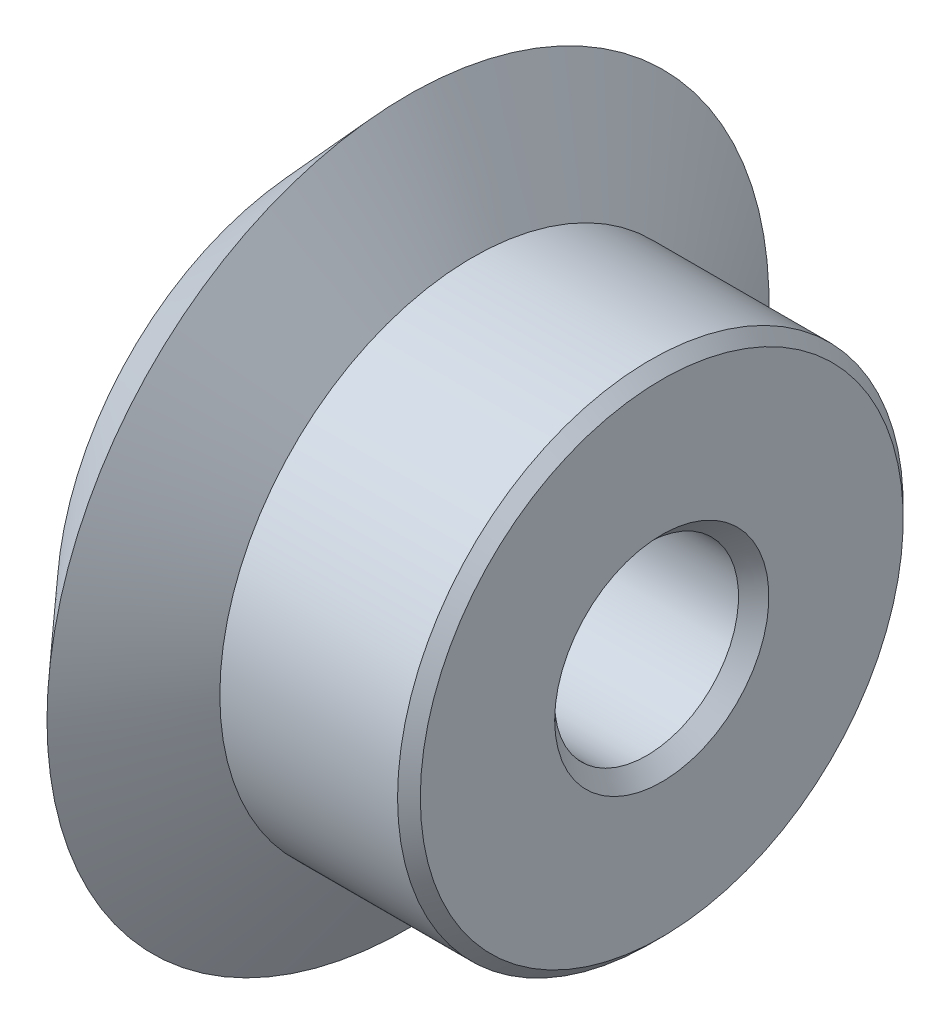
ISO-10303-21;
HEADER;
FILE_DESCRIPTION(('STEP AP214'),'2;1');
FILE_NAME('part.step','',(''),(''),'','','');
FILE_SCHEMA(('AUTOMOTIVE_DESIGN { 1 0 10303 214 1 1 1 1 }'));
ENDSEC;
DATA;
#1=APPLICATION_CONTEXT('core data for automotive mechanical design processes');
#2=APPLICATION_PROTOCOL_DEFINITION('international standard','automotive_design',2000,#1);
#3=PRODUCT_CONTEXT('',#1,'mechanical');
#4=PRODUCT('Part','Part','',(#3));
#5=PRODUCT_RELATED_PRODUCT_CATEGORY('part','',(#4));
#6=PRODUCT_DEFINITION_FORMATION('','',#4);
#7=PRODUCT_DEFINITION_CONTEXT('part definition',#1,'design');
#8=PRODUCT_DEFINITION('design','',#6,#7);
#9=PRODUCT_DEFINITION_SHAPE('','',#8);
#10=(LENGTH_UNIT() NAMED_UNIT(*) SI_UNIT(.MILLI.,.METRE.));
#11=(NAMED_UNIT(*) PLANE_ANGLE_UNIT() SI_UNIT($,.RADIAN.));
#12=(NAMED_UNIT(*) SI_UNIT($,.STERADIAN.) SOLID_ANGLE_UNIT());
#13=UNCERTAINTY_MEASURE_WITH_UNIT(LENGTH_MEASURE(1.E-05),#10,'distance_accuracy_value','');
#14=(GEOMETRIC_REPRESENTATION_CONTEXT(3) GLOBAL_UNCERTAINTY_ASSIGNED_CONTEXT((#13)) GLOBAL_UNIT_ASSIGNED_CONTEXT((#10,
#11,#12)) REPRESENTATION_CONTEXT('',''));
#15=CARTESIAN_POINT('',(0.,0.,0.));
#16=DIRECTION('',(0.,0.,1.));
#17=DIRECTION('',(1.,0.,0.));
#18=AXIS2_PLACEMENT_3D('',#15,#16,#17);
#19=CARTESIAN_POINT('',(-21.,0.,0.));
#20=DIRECTION('',(1.,0.,0.));
#21=DIRECTION('',(0.,0.,-1.));
#22=AXIS2_PLACEMENT_3D('',#19,#20,#21);
#23=PLANE('',#22);
#24=CARTESIAN_POINT('',(-21.,0.,0.));
#25=DIRECTION('',(-1.,0.,0.));
#26=DIRECTION('',(0.,0.,1.));
#27=AXIS2_PLACEMENT_3D('',#24,#25,#26);
#28=CIRCLE('',#27,14.8);
#29=CARTESIAN_POINT('',(-21.,0.,14.8));
#30=VERTEX_POINT('',#29);
#31=EDGE_CURVE('E10',#30,#30,#28,.T.);
#32=ORIENTED_EDGE('',*,*,#31,.T.);
#33=EDGE_LOOP('',(#32));
#34=FACE_BOUND('',#33,.T.);
#35=CARTESIAN_POINT('',(-21.,0.,0.));
#36=DIRECTION('',(-1.,0.,0.));
#37=DIRECTION('',(0.,0.,1.));
#38=AXIS2_PLACEMENT_3D('',#35,#36,#37);
#39=CIRCLE('',#38,6.99);
#40=CARTESIAN_POINT('',(-21.,0.,6.99));
#41=VERTEX_POINT('',#40);
#42=EDGE_CURVE('E56',#41,#41,#39,.T.);
#43=ORIENTED_EDGE('',*,*,#42,.F.);
#44=EDGE_LOOP('',(#43));
#45=FACE_BOUND('',#44,.T.);
#46=ADVANCED_FACE('F31',(#34,#45),#23,.F.);
#47=CARTESIAN_POINT('',(0.,15.7575378797541,0.));
#48=DIRECTION('',(-1.,0.,0.));
#49=DIRECTION('',(0.,0.,1.));
#50=AXIS2_PLACEMENT_3D('',#47,#48,#49);
#51=PLANE('',#50);
#52=CARTESIAN_POINT('',(0.,0.,0.));
#53=DIRECTION('',(-1.,0.,0.));
#54=DIRECTION('',(0.,0.,1.));
#55=AXIS2_PLACEMENT_3D('',#52,#53,#54);
#56=CIRCLE('',#55,15.7575378797541);
#57=CARTESIAN_POINT('',(0.,0.,15.7575378797541));
#58=VERTEX_POINT('',#57);
#59=EDGE_CURVE('E53',#58,#58,#56,.T.);
#60=ORIENTED_EDGE('',*,*,#59,.F.);
#61=EDGE_LOOP('',(#60));
#62=FACE_BOUND('',#61,.T.);
#63=CARTESIAN_POINT('',(0.,0.,0.));
#64=DIRECTION('',(-1.,0.,0.));
#65=DIRECTION('',(0.,0.,1.));
#66=AXIS2_PLACEMENT_3D('',#63,#64,#65);
#67=CIRCLE('',#66,6.99);
#68=CARTESIAN_POINT('',(0.,0.,6.99));
#69=VERTEX_POINT('',#68);
#70=EDGE_CURVE('E65',#69,#69,#67,.T.);
#71=ORIENTED_EDGE('',*,*,#70,.T.);
#72=EDGE_LOOP('',(#71));
#73=FACE_BOUND('',#72,.T.);
#74=ADVANCED_FACE('F69',(#62,#73),#51,.F.);
#75=CARTESIAN_POINT('',(-22.83,0.,0.));
#76=DIRECTION('',(-1.,0.,0.));
#77=DIRECTION('',(0.,0.,1.));
#78=AXIS2_PLACEMENT_3D('',#75,#76,#77);
#79=CONICAL_SURFACE('',#78,16.6693599711374,0.796037432440869);
#80=ORIENTED_EDGE('',*,*,#31,.F.);
#81=EDGE_LOOP('',(#80));
#82=FACE_BOUND('',#81,.T.);
#83=CARTESIAN_POINT('',(-22.83,0.,0.));
#84=DIRECTION('',(-1.,0.,0.));
#85=DIRECTION('',(0.,0.,1.));
#86=AXIS2_PLACEMENT_3D('',#83,#84,#85);
#87=CIRCLE('',#86,16.6693599711374);
#88=CARTESIAN_POINT('',(-22.83,0.,16.6693599711374));
#89=VERTEX_POINT('',#88);
#90=EDGE_CURVE('E37',#89,#89,#87,.T.);
#91=ORIENTED_EDGE('',*,*,#90,.T.);
#92=EDGE_LOOP('',(#91));
#93=FACE_BOUND('',#92,.T.);
#94=ADVANCED_FACE('F86',(#82,#93),#79,.F.);
#95=CARTESIAN_POINT('',(-16.56,0.,0.));
#96=DIRECTION('',(1.,0.,0.));
#97=DIRECTION('',(0.,0.,-1.));
#98=AXIS2_PLACEMENT_3D('',#95,#96,#97);
#99=CONICAL_SURFACE('',#98,23.56,0.832522053201295);
#100=ORIENTED_EDGE('',*,*,#90,.F.);
#101=EDGE_LOOP('',(#100));
#102=FACE_BOUND('',#101,.T.);
#103=CARTESIAN_POINT('',(-16.56,0.,0.));
#104=DIRECTION('',(-1.,0.,0.));
#105=DIRECTION('',(0.,0.,1.));
#106=AXIS2_PLACEMENT_3D('',#103,#104,#105);
#107=CIRCLE('',#106,23.56);
#108=CARTESIAN_POINT('',(-16.56,0.,23.56));
#109=VERTEX_POINT('',#108);
#110=EDGE_CURVE('E41',#109,#109,#107,.T.);
#111=ORIENTED_EDGE('',*,*,#110,.T.);
#112=EDGE_LOOP('',(#111));
#113=FACE_BOUND('',#112,.T.);
#114=ADVANCED_FACE('F112',(#102,#113),#99,.T.);
#115=CARTESIAN_POINT('',(-12.34,0.,0.));
#116=DIRECTION('',(-1.,0.,0.));
#117=DIRECTION('',(0.,0.,1.));
#118=AXIS2_PLACEMENT_3D('',#115,#116,#117);
#119=CONICAL_SURFACE('',#118,16.5,1.03204488169117);
#120=ORIENTED_EDGE('',*,*,#110,.F.);
#121=EDGE_LOOP('',(#120));
#122=FACE_BOUND('',#121,.T.);
#123=CARTESIAN_POINT('',(-12.34,0.,0.));
#124=DIRECTION('',(-1.,0.,0.));
#125=DIRECTION('',(0.,0.,1.));
#126=AXIS2_PLACEMENT_3D('',#123,#124,#125);
#127=CIRCLE('',#126,16.5);
#128=CARTESIAN_POINT('',(-12.34,0.,16.5));
#129=VERTEX_POINT('',#128);
#130=EDGE_CURVE('E45',#129,#129,#127,.T.);
#131=ORIENTED_EDGE('',*,*,#130,.T.);
#132=EDGE_LOOP('',(#131));
#133=FACE_BOUND('',#132,.T.);
#134=ADVANCED_FACE('F108',(#122,#133),#119,.T.);
#135=CARTESIAN_POINT('',(0.,0.,0.));
#136=DIRECTION('',(-1.,0.,0.));
#137=DIRECTION('',(0.,0.,1.));
#138=AXIS2_PLACEMENT_3D('',#135,#136,#137);
#139=CYLINDRICAL_SURFACE('',#138,16.5);
#140=ORIENTED_EDGE('',*,*,#130,.F.);
#141=EDGE_LOOP('',(#140));
#142=FACE_BOUND('',#141,.T.);
#143=CARTESIAN_POINT('',(-0.742462120245875,0.,0.));
#144=DIRECTION('',(-1.,0.,0.));
#145=DIRECTION('',(0.,0.,1.));
#146=AXIS2_PLACEMENT_3D('',#143,#144,#145);
#147=CIRCLE('',#146,16.5);
#148=CARTESIAN_POINT('',(-0.742462120245875,0.,16.5));
#149=VERTEX_POINT('',#148);
#150=EDGE_CURVE('E50',#149,#149,#147,.T.);
#151=ORIENTED_EDGE('',*,*,#150,.T.);
#152=EDGE_LOOP('',(#151));
#153=FACE_BOUND('',#152,.T.);
#154=ADVANCED_FACE('F102',(#142,#153),#139,.T.);
#155=CARTESIAN_POINT('',(0.,0.,0.));
#156=DIRECTION('',(-1.,0.,0.));
#157=DIRECTION('',(0.,0.,1.));
#158=AXIS2_PLACEMENT_3D('',#155,#156,#157);
#159=CONICAL_SURFACE('',#158,15.7575378797541,0.785398163397448);
#160=ORIENTED_EDGE('',*,*,#150,.F.);
#161=EDGE_LOOP('',(#160));
#162=FACE_BOUND('',#161,.T.);
#163=ORIENTED_EDGE('',*,*,#59,.T.);
#164=EDGE_LOOP('',(#163));
#165=FACE_BOUND('',#164,.T.);
#166=ADVANCED_FACE('F94',(#162,#165),#159,.T.);
#167=CARTESIAN_POINT('',(-20.01,0.,0.));
#168=DIRECTION('',(-1.,0.,0.));
#169=DIRECTION('',(0.,0.,1.));
#170=AXIS2_PLACEMENT_3D('',#167,#168,#169);
#171=CONICAL_SURFACE('',#170,6.,0.785398163397448);
#172=ORIENTED_EDGE('',*,*,#42,.T.);
#173=EDGE_LOOP('',(#172));
#174=FACE_BOUND('',#173,.T.);
#175=CARTESIAN_POINT('',(-20.01,0.,0.));
#176=DIRECTION('',(-1.,0.,0.));
#177=DIRECTION('',(0.,0.,1.));
#178=AXIS2_PLACEMENT_3D('',#175,#176,#177);
#179=CIRCLE('',#178,6.);
#180=CARTESIAN_POINT('',(-20.01,0.,6.));
#181=VERTEX_POINT('',#180);
#182=EDGE_CURVE('E59',#181,#181,#179,.T.);
#183=ORIENTED_EDGE('',*,*,#182,.F.);
#184=EDGE_LOOP('',(#183));
#185=FACE_BOUND('',#184,.T.);
#186=ADVANCED_FACE('F79',(#174,#185),#171,.F.);
#187=CARTESIAN_POINT('',(0.,0.,0.));
#188=DIRECTION('',(-1.,0.,0.));
#189=DIRECTION('',(0.,0.,1.));
#190=AXIS2_PLACEMENT_3D('',#187,#188,#189);
#191=CYLINDRICAL_SURFACE('',#190,6.);
#192=ORIENTED_EDGE('',*,*,#182,.T.);
#193=EDGE_LOOP('',(#192));
#194=FACE_BOUND('',#193,.T.);
#195=CARTESIAN_POINT('',(-0.990000000000002,0.,0.));
#196=DIRECTION('',(-1.,0.,0.));
#197=DIRECTION('',(0.,0.,1.));
#198=AXIS2_PLACEMENT_3D('',#195,#196,#197);
#199=CIRCLE('',#198,6.);
#200=CARTESIAN_POINT('',(-0.990000000000002,0.,6.));
#201=VERTEX_POINT('',#200);
#202=EDGE_CURVE('E62',#201,#201,#199,.T.);
#203=ORIENTED_EDGE('',*,*,#202,.F.);
#204=EDGE_LOOP('',(#203));
#205=FACE_BOUND('',#204,.T.);
#206=ADVANCED_FACE('F73',(#194,#205),#191,.F.);
#207=CARTESIAN_POINT('',(0.,0.,0.));
#208=DIRECTION('',(1.,0.,0.));
#209=DIRECTION('',(0.,0.,-1.));
#210=AXIS2_PLACEMENT_3D('',#207,#208,#209);
#211=CONICAL_SURFACE('',#210,6.99,0.785398163397447);
#212=ORIENTED_EDGE('',*,*,#202,.T.);
#213=EDGE_LOOP('',(#212));
#214=FACE_BOUND('',#213,.T.);
#215=ORIENTED_EDGE('',*,*,#70,.F.);
#216=EDGE_LOOP('',(#215));
#217=FACE_BOUND('',#216,.T.);
#218=ADVANCED_FACE('F71',(#214,#217),#211,.F.);
#219=CLOSED_SHELL('',(#46,#74,#94,#114,#134,#154,#166,#186,#206,#218));
#220=MANIFOLD_SOLID_BREP('B2',#219);
#221=ADVANCED_BREP_SHAPE_REPRESENTATION('',(#18,#220),#14);
#222=SHAPE_DEFINITION_REPRESENTATION(#9,#221);
ENDSEC;
END-ISO-10303-21;
